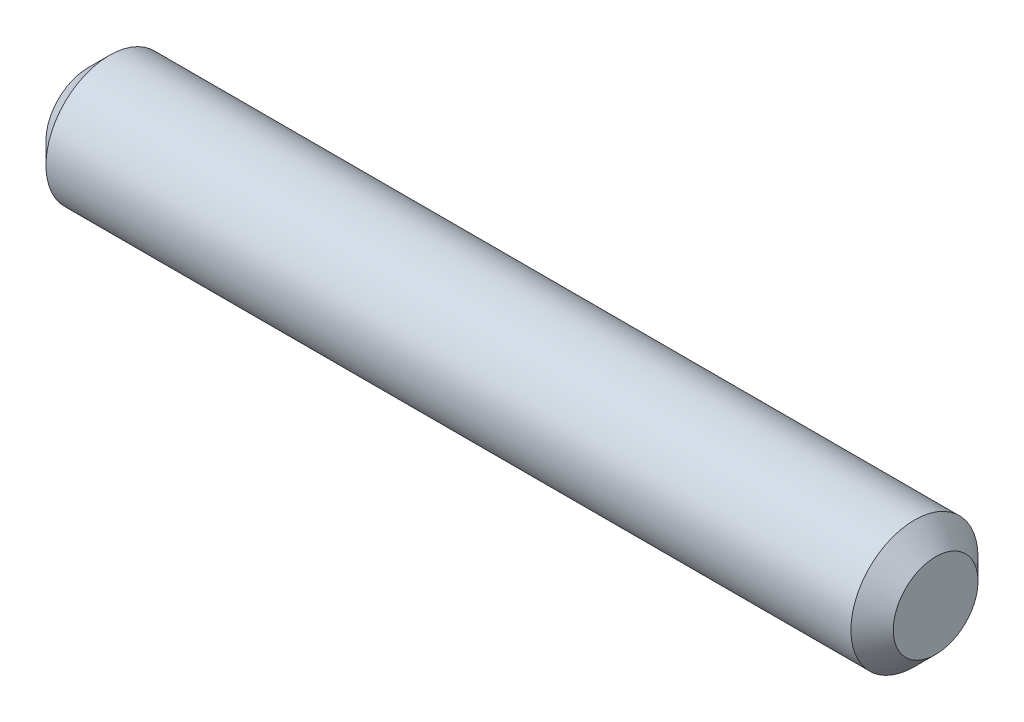
ISO-10303-21;
HEADER;
FILE_DESCRIPTION(('STEP AP214'),'2;1');
FILE_NAME('part.step','',(''),(''),'','','');
FILE_SCHEMA(('AUTOMOTIVE_DESIGN { 1 0 10303 214 1 1 1 1 }'));
ENDSEC;
DATA;
#1=APPLICATION_CONTEXT('core data for automotive mechanical design processes');
#2=APPLICATION_PROTOCOL_DEFINITION('international standard','automotive_design',2000,#1);
#3=PRODUCT_CONTEXT('',#1,'mechanical');
#4=PRODUCT('Part','Part','',(#3));
#5=PRODUCT_RELATED_PRODUCT_CATEGORY('part','',(#4));
#6=PRODUCT_DEFINITION_FORMATION('','',#4);
#7=PRODUCT_DEFINITION_CONTEXT('part definition',#1,'design');
#8=PRODUCT_DEFINITION('design','',#6,#7);
#9=PRODUCT_DEFINITION_SHAPE('','',#8);
#10=(LENGTH_UNIT() NAMED_UNIT(*) SI_UNIT(.MILLI.,.METRE.));
#11=(NAMED_UNIT(*) PLANE_ANGLE_UNIT() SI_UNIT($,.RADIAN.));
#12=(NAMED_UNIT(*) SI_UNIT($,.STERADIAN.) SOLID_ANGLE_UNIT());
#13=UNCERTAINTY_MEASURE_WITH_UNIT(LENGTH_MEASURE(1.E-05),#10,'distance_accuracy_value','');
#14=(GEOMETRIC_REPRESENTATION_CONTEXT(3) GLOBAL_UNCERTAINTY_ASSIGNED_CONTEXT((#13)) GLOBAL_UNIT_ASSIGNED_CONTEXT((#10,
#11,#12)) REPRESENTATION_CONTEXT('',''));
#15=CARTESIAN_POINT('',(0.,0.,0.));
#16=DIRECTION('',(0.,0.,1.));
#17=DIRECTION('',(1.,0.,0.));
#18=AXIS2_PLACEMENT_3D('',#15,#16,#17);
#19=CARTESIAN_POINT('',(20.,0.5,0.));
#20=DIRECTION('',(1.,0.,0.));
#21=DIRECTION('',(0.,0.,-1.));
#22=AXIS2_PLACEMENT_3D('',#19,#20,#21);
#23=PLANE('',#22);
#24=CARTESIAN_POINT('',(20.0000000000387,0.,0.));
#25=DIRECTION('',(-1.,0.,0.));
#26=DIRECTION('',(0.,0.,1.));
#27=AXIS2_PLACEMENT_3D('',#24,#25,#26);
#28=CIRCLE('',#27,1.0000000000332);
#29=CARTESIAN_POINT('',(20.0000000000387,0.,1.0000000000332));
#30=VERTEX_POINT('',#29);
#31=EDGE_CURVE('E18',#30,#30,#28,.T.);
#32=ORIENTED_EDGE('',*,*,#31,.F.);
#33=EDGE_LOOP('',(#32));
#34=FACE_BOUND('',#33,.T.);
#35=ADVANCED_FACE('F15',(#34),#23,.T.);
#36=CARTESIAN_POINT('',(0.,0.5,0.));
#37=DIRECTION('',(-1.,0.,0.));
#38=DIRECTION('',(0.,0.,1.));
#39=AXIS2_PLACEMENT_3D('',#36,#37,#38);
#40=PLANE('',#39);
#41=CARTESIAN_POINT('',(0.,0.,0.));
#42=DIRECTION('',(1.,0.,0.));
#43=DIRECTION('',(0.,0.,-1.));
#44=AXIS2_PLACEMENT_3D('',#41,#42,#43);
#45=CIRCLE('',#44,1.00000000009004);
#46=CARTESIAN_POINT('',(0.,0.,-1.00000000009004));
#47=VERTEX_POINT('',#46);
#48=EDGE_CURVE('E27',#47,#47,#45,.T.);
#49=ORIENTED_EDGE('',*,*,#48,.F.);
#50=EDGE_LOOP('',(#49));
#51=FACE_BOUND('',#50,.T.);
#52=ADVANCED_FACE('F39',(#51),#40,.T.);
#53=CARTESIAN_POINT('',(19.5000000001073,0.,0.));
#54=DIRECTION('',(-1.,0.,0.));
#55=DIRECTION('',(0.,0.,1.));
#56=AXIS2_PLACEMENT_3D('',#53,#54,#55);
#57=CONICAL_SURFACE('',#56,1.49999999990769,0.785398163340605);
#58=ORIENTED_EDGE('',*,*,#31,.T.);
#59=EDGE_LOOP('',(#58));
#60=FACE_BOUND('',#59,.T.);
#61=CARTESIAN_POINT('',(19.5,0.,0.));
#62=DIRECTION('',(1.,0.,0.));
#63=DIRECTION('',(0.,0.,-1.));
#64=AXIS2_PLACEMENT_3D('',#61,#62,#63);
#65=CIRCLE('',#64,1.5);
#66=CARTESIAN_POINT('',(19.5,0.,-1.5));
#67=VERTEX_POINT('',#66);
#68=EDGE_CURVE('E22',#67,#67,#65,.F.);
#69=ORIENTED_EDGE('',*,*,#68,.F.);
#70=EDGE_LOOP('',(#69));
#71=FACE_BOUND('',#70,.T.);
#72=ADVANCED_FACE('F35',(#60,#71),#57,.T.);
#73=CARTESIAN_POINT('',(0.499999999988177,0.,0.));
#74=DIRECTION('',(1.,0.,0.));
#75=DIRECTION('',(0.,0.,-1.));
#76=AXIS2_PLACEMENT_3D('',#73,#74,#75);
#77=CONICAL_SURFACE('',#76,1.50000000007822,0.785398163397448);
#78=ORIENTED_EDGE('',*,*,#48,.T.);
#79=EDGE_LOOP('',(#78));
#80=FACE_BOUND('',#79,.T.);
#81=CARTESIAN_POINT('',(0.5,0.,0.));
#82=DIRECTION('',(1.,0.,0.));
#83=DIRECTION('',(0.,0.,-1.));
#84=AXIS2_PLACEMENT_3D('',#81,#82,#83);
#85=CIRCLE('',#84,1.5);
#86=CARTESIAN_POINT('',(0.5,0.,-1.5));
#87=VERTEX_POINT('',#86);
#88=EDGE_CURVE('E10',#87,#87,#85,.T.);
#89=ORIENTED_EDGE('',*,*,#88,.F.);
#90=EDGE_LOOP('',(#89));
#91=FACE_BOUND('',#90,.T.);
#92=ADVANCED_FACE('F47',(#80,#91),#77,.T.);
#93=CARTESIAN_POINT('',(10.,0.,0.));
#94=DIRECTION('',(1.,0.,0.));
#95=DIRECTION('',(0.,0.,-1.));
#96=AXIS2_PLACEMENT_3D('',#93,#94,#95);
#97=CYLINDRICAL_SURFACE('',#96,1.5);
#98=ORIENTED_EDGE('',*,*,#68,.T.);
#99=EDGE_LOOP('',(#98));
#100=FACE_BOUND('',#99,.T.);
#101=ORIENTED_EDGE('',*,*,#88,.T.);
#102=EDGE_LOOP('',(#101));
#103=FACE_BOUND('',#102,.T.);
#104=ADVANCED_FACE('F45',(#100,#103),#97,.T.);
#105=CLOSED_SHELL('',(#35,#52,#72,#92,#104));
#106=MANIFOLD_SOLID_BREP('B1',#105);
#107=ADVANCED_BREP_SHAPE_REPRESENTATION('',(#18,#106),#14);
#108=SHAPE_DEFINITION_REPRESENTATION(#9,#107);
ENDSEC;
END-ISO-10303-21;
